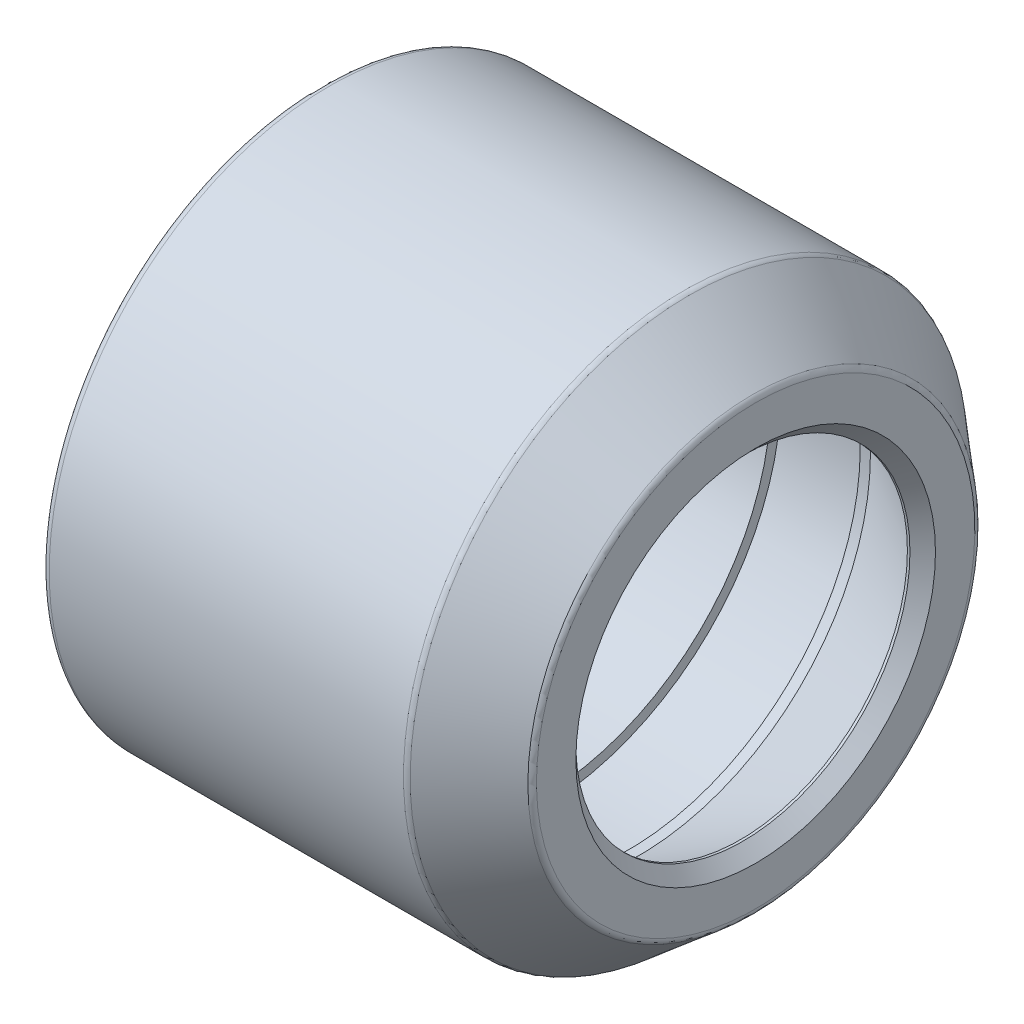
ISO-10303-21;
HEADER;
FILE_DESCRIPTION(('STEP AP214'),'2;1');
FILE_NAME('part.step','',(''),(''),'','','');
FILE_SCHEMA(('AUTOMOTIVE_DESIGN { 1 0 10303 214 1 1 1 1 }'));
ENDSEC;
DATA;
#1=APPLICATION_CONTEXT('core data for automotive mechanical design processes');
#2=APPLICATION_PROTOCOL_DEFINITION('international standard','automotive_design',2000,#1);
#3=PRODUCT_CONTEXT('',#1,'mechanical');
#4=PRODUCT('Part','Part','',(#3));
#5=PRODUCT_RELATED_PRODUCT_CATEGORY('part','',(#4));
#6=PRODUCT_DEFINITION_FORMATION('','',#4);
#7=PRODUCT_DEFINITION_CONTEXT('part definition',#1,'design');
#8=PRODUCT_DEFINITION('design','',#6,#7);
#9=PRODUCT_DEFINITION_SHAPE('','',#8);
#10=(LENGTH_UNIT() NAMED_UNIT(*) SI_UNIT(.MILLI.,.METRE.));
#11=(NAMED_UNIT(*) PLANE_ANGLE_UNIT() SI_UNIT($,.RADIAN.));
#12=(NAMED_UNIT(*) SI_UNIT($,.STERADIAN.) SOLID_ANGLE_UNIT());
#13=UNCERTAINTY_MEASURE_WITH_UNIT(LENGTH_MEASURE(1.E-05),#10,'distance_accuracy_value','');
#14=(GEOMETRIC_REPRESENTATION_CONTEXT(3) GLOBAL_UNCERTAINTY_ASSIGNED_CONTEXT((#13)) GLOBAL_UNIT_ASSIGNED_CONTEXT((#10,
#11,#12)) REPRESENTATION_CONTEXT('',''));
#15=CARTESIAN_POINT('',(0.,0.,0.));
#16=DIRECTION('',(0.,0.,1.));
#17=DIRECTION('',(1.,0.,0.));
#18=AXIS2_PLACEMENT_3D('',#15,#16,#17);
#19=CARTESIAN_POINT('',(12.2,0.,0.));
#20=DIRECTION('',(1.,0.,0.));
#21=DIRECTION('',(0.,0.,-1.));
#22=AXIS2_PLACEMENT_3D('',#19,#20,#21);
#23=CYLINDRICAL_SURFACE('',#22,9.1);
#24=CARTESIAN_POINT('',(12.,0.,0.));
#25=DIRECTION('',(1.,0.,0.));
#26=DIRECTION('',(0.,0.,-1.));
#27=AXIS2_PLACEMENT_3D('',#24,#25,#26);
#28=CIRCLE('',#27,9.1);
#29=CARTESIAN_POINT('',(12.,0.,-9.1));
#30=VERTEX_POINT('',#29);
#31=EDGE_CURVE('E161',#30,#30,#28,.T.);
#32=ORIENTED_EDGE('',*,*,#31,.F.);
#33=EDGE_LOOP('',(#32));
#34=FACE_BOUND('',#33,.T.);
#35=CARTESIAN_POINT('',(12.400000000002,0.,0.));
#36=DIRECTION('',(-1.,0.,0.));
#37=DIRECTION('',(0.,1.,0.));
#38=AXIS2_PLACEMENT_3D('',#35,#36,#37);
#39=CIRCLE('',#38,9.10000000000341);
#40=CARTESIAN_POINT('',(12.400000000002,9.10000000000341,0.));
#41=VERTEX_POINT('',#40);
#42=EDGE_CURVE('E158',#41,#41,#39,.F.);
#43=ORIENTED_EDGE('',*,*,#42,.T.);
#44=EDGE_LOOP('',(#43));
#45=FACE_BOUND('',#44,.T.);
#46=ADVANCED_FACE('F15',(#34,#45),#23,.F.);
#47=CARTESIAN_POINT('',(12.400000000002,0.,0.));
#48=DIRECTION('',(-1.,0.,0.));
#49=DIRECTION('',(0.,0.,1.));
#50=AXIS2_PLACEMENT_3D('',#47,#48,#49);
#51=CONICAL_SURFACE('',#50,9.10000000000341,0.523598775599998);
#52=ORIENTED_EDGE('',*,*,#42,.F.);
#53=EDGE_LOOP('',(#52));
#54=FACE_BOUND('',#53,.T.);
#55=CARTESIAN_POINT('',(16.399999999998,0.,0.));
#56=DIRECTION('',(-1.,0.,0.));
#57=DIRECTION('',(0.,0.,1.));
#58=AXIS2_PLACEMENT_3D('',#55,#56,#57);
#59=CIRCLE('',#58,6.79059892323811);
#60=CARTESIAN_POINT('',(16.399999999998,0.,6.79059892323811));
#61=VERTEX_POINT('',#60);
#62=EDGE_CURVE('E185',#61,#61,#59,.T.);
#63=ORIENTED_EDGE('',*,*,#62,.F.);
#64=EDGE_LOOP('',(#63));
#65=FACE_BOUND('',#64,.T.);
#66=ADVANCED_FACE('F199',(#54,#65),#51,.F.);
#67=CARTESIAN_POINT('',(12.,9.5,0.));
#68=DIRECTION('',(-1.,0.,0.));
#69=DIRECTION('',(0.,0.,1.));
#70=AXIS2_PLACEMENT_3D('',#67,#68,#69);
#71=PLANE('',#70);
#72=ORIENTED_EDGE('',*,*,#31,.T.);
#73=EDGE_LOOP('',(#72));
#74=FACE_BOUND('',#73,.T.);
#75=CARTESIAN_POINT('',(12.,0.,0.));
#76=DIRECTION('',(1.,0.,0.));
#77=DIRECTION('',(0.,0.,-1.));
#78=AXIS2_PLACEMENT_3D('',#75,#76,#77);
#79=CIRCLE('',#78,9.5);
#80=CARTESIAN_POINT('',(12.,0.,-9.5));
#81=VERTEX_POINT('',#80);
#82=EDGE_CURVE('E180',#81,#81,#79,.F.);
#83=ORIENTED_EDGE('',*,*,#82,.T.);
#84=EDGE_LOOP('',(#83));
#85=FACE_BOUND('',#84,.T.);
#86=ADVANCED_FACE('F194',(#74,#85),#71,.T.);
#87=CARTESIAN_POINT('',(16.4,6.79059892324151,0.));
#88=DIRECTION('',(-1.,0.,0.));
#89=DIRECTION('',(0.,0.,1.));
#90=AXIS2_PLACEMENT_3D('',#87,#88,#89);
#91=PLANE('',#90);
#92=CARTESIAN_POINT('',(16.4,0.,0.));
#93=DIRECTION('',(1.,0.,0.));
#94=DIRECTION('',(0.,0.,-1.));
#95=AXIS2_PLACEMENT_3D('',#92,#93,#94);
#96=CIRCLE('',#95,6.55);
#97=CARTESIAN_POINT('',(16.4,0.,-6.55));
#98=VERTEX_POINT('',#97);
#99=EDGE_CURVE('E175',#98,#98,#96,.T.);
#100=ORIENTED_EDGE('',*,*,#99,.T.);
#101=EDGE_LOOP('',(#100));
#102=FACE_BOUND('',#101,.T.);
#103=ORIENTED_EDGE('',*,*,#62,.T.);
#104=EDGE_LOOP('',(#103));
#105=FACE_BOUND('',#104,.T.);
#106=ADVANCED_FACE('F206',(#102,#105),#91,.T.);
#107=CARTESIAN_POINT('',(10.25,0.,0.));
#108=DIRECTION('',(1.,0.,0.));
#109=DIRECTION('',(0.,0.,-1.));
#110=AXIS2_PLACEMENT_3D('',#107,#108,#109);
#111=CYLINDRICAL_SURFACE('',#110,9.5);
#112=CARTESIAN_POINT('',(8.5,0.,0.));
#113=DIRECTION('',(1.,0.,0.));
#114=DIRECTION('',(0.,0.,-1.));
#115=AXIS2_PLACEMENT_3D('',#112,#113,#114);
#116=CIRCLE('',#115,9.5);
#117=CARTESIAN_POINT('',(8.5,0.,-9.5));
#118=VERTEX_POINT('',#117);
#119=EDGE_CURVE('E155',#118,#118,#116,.T.);
#120=ORIENTED_EDGE('',*,*,#119,.F.);
#121=EDGE_LOOP('',(#120));
#122=FACE_BOUND('',#121,.T.);
#123=ORIENTED_EDGE('',*,*,#82,.F.);
#124=EDGE_LOOP('',(#123));
#125=FACE_BOUND('',#124,.T.);
#126=ADVANCED_FACE('F208',(#122,#125),#111,.F.);
#127=CARTESIAN_POINT('',(16.45,0.,0.));
#128=DIRECTION('',(1.,0.,0.));
#129=DIRECTION('',(0.,0.,-1.));
#130=AXIS2_PLACEMENT_3D('',#127,#128,#129);
#131=CYLINDRICAL_SURFACE('',#130,6.55);
#132=ORIENTED_EDGE('',*,*,#99,.F.);
#133=EDGE_LOOP('',(#132));
#134=FACE_BOUND('',#133,.T.);
#135=CARTESIAN_POINT('',(16.4999999999509,0.,0.));
#136=DIRECTION('',(1.,0.,0.));
#137=DIRECTION('',(0.,1.,0.));
#138=AXIS2_PLACEMENT_3D('',#135,#136,#137);
#139=CIRCLE('',#138,6.54999999994743);
#140=CARTESIAN_POINT('',(16.4999999999509,6.54999999994743,0.));
#141=VERTEX_POINT('',#140);
#142=EDGE_CURVE('E146',#141,#141,#139,.T.);
#143=ORIENTED_EDGE('',*,*,#142,.T.);
#144=EDGE_LOOP('',(#143));
#145=FACE_BOUND('',#144,.T.);
#146=ADVANCED_FACE('F216',(#134,#145),#131,.F.);
#147=CARTESIAN_POINT('',(8.5,9.1,0.));
#148=DIRECTION('',(1.,0.,0.));
#149=DIRECTION('',(0.,0.,-1.));
#150=AXIS2_PLACEMENT_3D('',#147,#148,#149);
#151=PLANE('',#150);
#152=CARTESIAN_POINT('',(8.5,0.,0.));
#153=DIRECTION('',(1.,0.,0.));
#154=DIRECTION('',(0.,0.,-1.));
#155=AXIS2_PLACEMENT_3D('',#152,#153,#154);
#156=CIRCLE('',#155,9.1);
#157=CARTESIAN_POINT('',(8.5,0.,-9.1));
#158=VERTEX_POINT('',#157);
#159=EDGE_CURVE('E154',#158,#158,#156,.F.);
#160=ORIENTED_EDGE('',*,*,#159,.T.);
#161=EDGE_LOOP('',(#160));
#162=FACE_BOUND('',#161,.T.);
#163=ORIENTED_EDGE('',*,*,#119,.T.);
#164=EDGE_LOOP('',(#163));
#165=FACE_BOUND('',#164,.T.);
#166=ADVANCED_FACE('F274',(#162,#165),#151,.T.);
#167=CARTESIAN_POINT('',(16.9999999998822,0.,0.));
#168=DIRECTION('',(1.,0.,0.));
#169=DIRECTION('',(0.,0.,-1.));
#170=AXIS2_PLACEMENT_3D('',#167,#168,#169);
#171=CONICAL_SURFACE('',#170,7.04999999987876,0.785398163397448);
#172=ORIENTED_EDGE('',*,*,#142,.F.);
#173=EDGE_LOOP('',(#172));
#174=FACE_BOUND('',#173,.T.);
#175=CARTESIAN_POINT('',(16.9999999999959,0.,0.));
#176=DIRECTION('',(1.,0.,0.));
#177=DIRECTION('',(0.,0.,-1.));
#178=AXIS2_PLACEMENT_3D('',#175,#176,#177);
#179=CIRCLE('',#178,7.04999999999245);
#180=CARTESIAN_POINT('',(16.9999999999959,0.,-7.04999999999245));
#181=VERTEX_POINT('',#180);
#182=EDGE_CURVE('E164',#181,#181,#179,.F.);
#183=ORIENTED_EDGE('',*,*,#182,.F.);
#184=EDGE_LOOP('',(#183));
#185=FACE_BOUND('',#184,.T.);
#186=ADVANCED_FACE('F267',(#174,#185),#171,.F.);
#187=CARTESIAN_POINT('',(4.4,0.,0.));
#188=DIRECTION('',(1.,0.,0.));
#189=DIRECTION('',(0.,0.,-1.));
#190=AXIS2_PLACEMENT_3D('',#187,#188,#189);
#191=CYLINDRICAL_SURFACE('',#190,9.1);
#192=CARTESIAN_POINT('',(0.300000000000001,0.,0.));
#193=DIRECTION('',(1.,0.,0.));
#194=DIRECTION('',(0.,0.,-1.));
#195=AXIS2_PLACEMENT_3D('',#192,#193,#194);
#196=CIRCLE('',#195,9.1);
#197=CARTESIAN_POINT('',(0.300000000000001,0.,-9.1));
#198=VERTEX_POINT('',#197);
#199=EDGE_CURVE('E107',#198,#198,#196,.T.);
#200=ORIENTED_EDGE('',*,*,#199,.F.);
#201=EDGE_LOOP('',(#200));
#202=FACE_BOUND('',#201,.T.);
#203=ORIENTED_EDGE('',*,*,#159,.F.);
#204=EDGE_LOOP('',(#203));
#205=FACE_BOUND('',#204,.T.);
#206=ADVANCED_FACE('F260',(#202,#205),#191,.F.);
#207=CARTESIAN_POINT('',(17.,7.05,0.));
#208=DIRECTION('',(1.,0.,0.));
#209=DIRECTION('',(0.,0.,-1.));
#210=AXIS2_PLACEMENT_3D('',#207,#208,#209);
#211=PLANE('',#210);
#212=ORIENTED_EDGE('',*,*,#182,.T.);
#213=EDGE_LOOP('',(#212));
#214=FACE_BOUND('',#213,.T.);
#215=CARTESIAN_POINT('',(17.,0.,0.));
#216=DIRECTION('',(-1.,0.,0.));
#217=DIRECTION('',(0.,1.,0.));
#218=AXIS2_PLACEMENT_3D('',#215,#216,#217);
#219=CIRCLE('',#218,8.59453869837485);
#220=CARTESIAN_POINT('',(17.,8.59453869837485,0.));
#221=VERTEX_POINT('',#220);
#222=EDGE_CURVE('E132',#221,#221,#219,.T.);
#223=ORIENTED_EDGE('',*,*,#222,.F.);
#224=EDGE_LOOP('',(#223));
#225=FACE_BOUND('',#224,.T.);
#226=ADVANCED_FACE('F113',(#214,#225),#211,.T.);
#227=CARTESIAN_POINT('',(0.300000000000002,0.,0.));
#228=DIRECTION('',(1.,0.,0.));
#229=DIRECTION('',(0.,0.,-1.));
#230=AXIS2_PLACEMENT_3D('',#227,#228,#229);
#231=TOROIDAL_SURFACE('',#230,9.4,0.300000000000002);
#232=CARTESIAN_POINT('',(0.,0.,0.));
#233=DIRECTION('',(-1.,0.,0.));
#234=DIRECTION('',(0.,1.,0.));
#235=AXIS2_PLACEMENT_3D('',#232,#233,#234);
#236=CIRCLE('',#235,9.4);
#237=CARTESIAN_POINT('',(0.,9.4,0.));
#238=VERTEX_POINT('',#237);
#239=EDGE_CURVE('E60',#238,#238,#236,.F.);
#240=ORIENTED_EDGE('',*,*,#239,.F.);
#241=EDGE_LOOP('',(#240));
#242=FACE_BOUND('',#241,.T.);
#243=ORIENTED_EDGE('',*,*,#199,.T.);
#244=EDGE_LOOP('',(#243));
#245=FACE_BOUND('',#244,.T.);
#246=ADVANCED_FACE('F109',(#242,#245),#231,.T.);
#247=CARTESIAN_POINT('',(16.7,0.,0.));
#248=DIRECTION('',(1.,0.,0.));
#249=DIRECTION('',(0.,0.,-1.));
#250=AXIS2_PLACEMENT_3D('',#247,#248,#249);
#251=TOROIDAL_SURFACE('',#250,8.59453869837485,0.300000000000005);
#252=ORIENTED_EDGE('',*,*,#222,.T.);
#253=EDGE_LOOP('',(#252));
#254=FACE_BOUND('',#253,.T.);
#255=CARTESIAN_POINT('',(16.8928362829036,0.,0.));
#256=DIRECTION('',(-1.,0.,0.));
#257=DIRECTION('',(0.,1.,0.));
#258=AXIS2_PLACEMENT_3D('',#255,#256,#257);
#259=CIRCLE('',#258,8.82435203130766);
#260=CARTESIAN_POINT('',(16.8928362829036,8.82435203130766,0.));
#261=VERTEX_POINT('',#260);
#262=EDGE_CURVE('E56',#261,#261,#259,.T.);
#263=ORIENTED_EDGE('',*,*,#262,.F.);
#264=EDGE_LOOP('',(#263));
#265=FACE_BOUND('',#264,.T.);
#266=ADVANCED_FACE('F81',(#254,#265),#251,.T.);
#267=CARTESIAN_POINT('',(0.,10.7,0.));
#268=DIRECTION('',(-1.,0.,0.));
#269=DIRECTION('',(0.,0.,1.));
#270=AXIS2_PLACEMENT_3D('',#267,#268,#269);
#271=PLANE('',#270);
#272=ORIENTED_EDGE('',*,*,#239,.T.);
#273=EDGE_LOOP('',(#272));
#274=FACE_BOUND('',#273,.T.);
#275=CARTESIAN_POINT('',(0.,0.,0.));
#276=DIRECTION('',(1.,0.,0.));
#277=DIRECTION('',(0.,1.,0.));
#278=AXIS2_PLACEMENT_3D('',#275,#276,#277);
#279=CIRCLE('',#278,10.7);
#280=CARTESIAN_POINT('',(0.,10.7,0.));
#281=VERTEX_POINT('',#280);
#282=EDGE_CURVE('E59',#281,#281,#279,.T.);
#283=ORIENTED_EDGE('',*,*,#282,.F.);
#284=EDGE_LOOP('',(#283));
#285=FACE_BOUND('',#284,.T.);
#286=ADVANCED_FACE('F72',(#274,#285),#271,.T.);
#287=CARTESIAN_POINT('',(14.3836452126285,0.,0.));
#288=DIRECTION('',(-1.,0.,0.));
#289=DIRECTION('',(0.,0.,1.));
#290=AXIS2_PLACEMENT_3D('',#287,#288,#289);
#291=CONICAL_SURFACE('',#290,10.9298133329385,0.698131700799998);
#292=ORIENTED_EDGE('',*,*,#262,.T.);
#293=EDGE_LOOP('',(#292));
#294=FACE_BOUND('',#293,.T.);
#295=CARTESIAN_POINT('',(14.3836452126261,0.,0.));
#296=DIRECTION('',(1.,0.,0.));
#297=DIRECTION('',(0.,0.,-1.));
#298=AXIS2_PLACEMENT_3D('',#295,#296,#297);
#299=CIRCLE('',#298,10.9298133329357);
#300=CARTESIAN_POINT('',(14.3836452126261,0.,-10.9298133329357));
#301=VERTEX_POINT('',#300);
#302=EDGE_CURVE('E27',#301,#301,#299,.F.);
#303=ORIENTED_EDGE('',*,*,#302,.F.);
#304=EDGE_LOOP('',(#303));
#305=FACE_BOUND('',#304,.T.);
#306=ADVANCED_FACE('F49',(#294,#305),#291,.T.);
#307=CARTESIAN_POINT('',(0.3,0.,0.));
#308=DIRECTION('',(1.,0.,0.));
#309=DIRECTION('',(0.,0.,-1.));
#310=AXIS2_PLACEMENT_3D('',#307,#308,#309);
#311=TOROIDAL_SURFACE('',#310,10.7,0.3);
#312=CARTESIAN_POINT('',(0.300000000000002,0.,0.));
#313=DIRECTION('',(1.,0.,0.));
#314=DIRECTION('',(0.,0.,-1.));
#315=AXIS2_PLACEMENT_3D('',#312,#313,#314);
#316=CIRCLE('',#315,11.);
#317=CARTESIAN_POINT('',(0.300000000000002,0.,-11.));
#318=VERTEX_POINT('',#317);
#319=EDGE_CURVE('E22',#318,#318,#316,.T.);
#320=ORIENTED_EDGE('',*,*,#319,.F.);
#321=EDGE_LOOP('',(#320));
#322=FACE_BOUND('',#321,.T.);
#323=ORIENTED_EDGE('',*,*,#282,.T.);
#324=EDGE_LOOP('',(#323));
#325=FACE_BOUND('',#324,.T.);
#326=ADVANCED_FACE('F43',(#322,#325),#311,.T.);
#327=CARTESIAN_POINT('',(14.1908089297201,0.,0.));
#328=DIRECTION('',(1.,0.,0.));
#329=DIRECTION('',(0.,0.,-1.));
#330=AXIS2_PLACEMENT_3D('',#327,#328,#329);
#331=TOROIDAL_SURFACE('',#330,10.7,0.299999999999998);
#332=ORIENTED_EDGE('',*,*,#302,.T.);
#333=EDGE_LOOP('',(#332));
#334=FACE_BOUND('',#333,.T.);
#335=CARTESIAN_POINT('',(14.1908089297201,0.,0.));
#336=DIRECTION('',(1.,0.,0.));
#337=DIRECTION('',(0.,0.,-1.));
#338=AXIS2_PLACEMENT_3D('',#335,#336,#337);
#339=CIRCLE('',#338,11.);
#340=CARTESIAN_POINT('',(14.1908089297201,0.,-11.));
#341=VERTEX_POINT('',#340);
#342=EDGE_CURVE('E10',#341,#341,#339,.F.);
#343=ORIENTED_EDGE('',*,*,#342,.F.);
#344=EDGE_LOOP('',(#343));
#345=FACE_BOUND('',#344,.T.);
#346=ADVANCED_FACE('F38',(#334,#345),#331,.T.);
#347=CARTESIAN_POINT('',(7.24540446486007,0.,0.));
#348=DIRECTION('',(1.,0.,0.));
#349=DIRECTION('',(0.,0.,-1.));
#350=AXIS2_PLACEMENT_3D('',#347,#348,#349);
#351=CYLINDRICAL_SURFACE('',#350,11.);
#352=ORIENTED_EDGE('',*,*,#342,.T.);
#353=EDGE_LOOP('',(#352));
#354=FACE_BOUND('',#353,.T.);
#355=ORIENTED_EDGE('',*,*,#319,.T.);
#356=EDGE_LOOP('',(#355));
#357=FACE_BOUND('',#356,.T.);
#358=ADVANCED_FACE('F42',(#354,#357),#351,.T.);
#359=CLOSED_SHELL('',(#46,#66,#86,#106,#126,#146,#166,#186,#206,#226,#246,#266,#286,#306,#326,
#346,#358));
#360=MANIFOLD_SOLID_BREP('B1',#359);
#361=ADVANCED_BREP_SHAPE_REPRESENTATION('',(#18,#360),#14);
#362=SHAPE_DEFINITION_REPRESENTATION(#9,#361);
ENDSEC;
END-ISO-10303-21;
